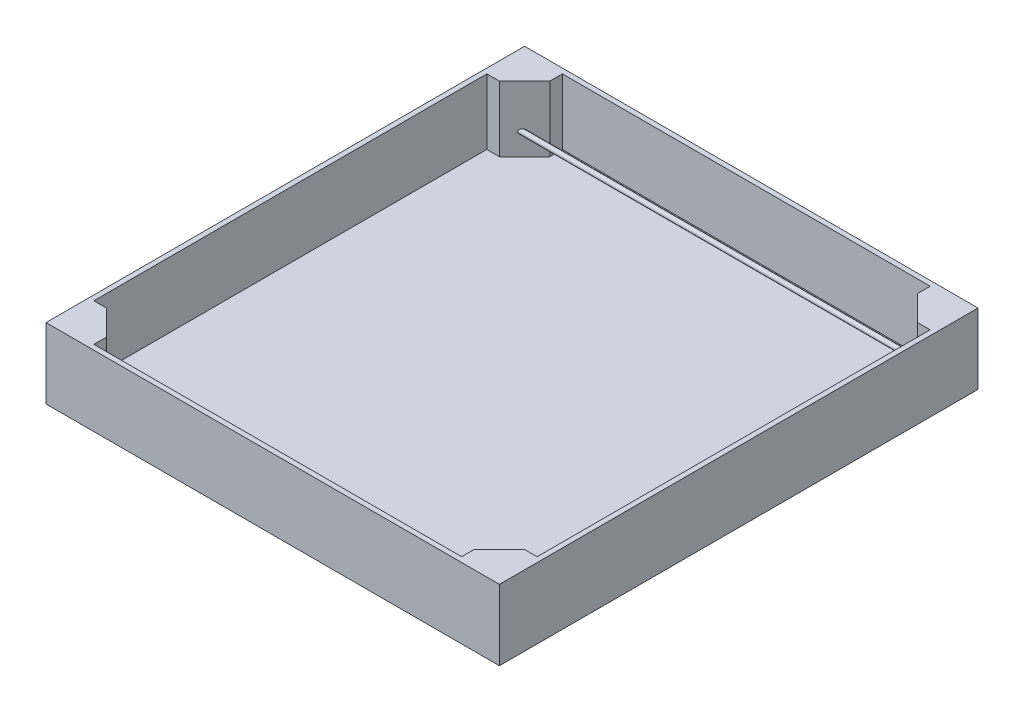
ISO-10303-21;
HEADER;
FILE_DESCRIPTION(('STEP AP214'),'2;1');
FILE_NAME('part.step','',(''),(''),'','','');
FILE_SCHEMA(('AUTOMOTIVE_DESIGN { 1 0 10303 214 1 1 1 1 }'));
ENDSEC;
DATA;
#1=APPLICATION_CONTEXT('core data for automotive mechanical design processes');
#2=APPLICATION_PROTOCOL_DEFINITION('international standard','automotive_design',2000,#1);
#3=PRODUCT_CONTEXT('',#1,'mechanical');
#4=PRODUCT('Part','Part','',(#3));
#5=PRODUCT_RELATED_PRODUCT_CATEGORY('part','',(#4));
#6=PRODUCT_DEFINITION_FORMATION('','',#4);
#7=PRODUCT_DEFINITION_CONTEXT('part definition',#1,'design');
#8=PRODUCT_DEFINITION('design','',#6,#7);
#9=PRODUCT_DEFINITION_SHAPE('','',#8);
#10=(LENGTH_UNIT() NAMED_UNIT(*) SI_UNIT(.MILLI.,.METRE.));
#11=(NAMED_UNIT(*) PLANE_ANGLE_UNIT() SI_UNIT($,.RADIAN.));
#12=(NAMED_UNIT(*) SI_UNIT($,.STERADIAN.) SOLID_ANGLE_UNIT());
#13=UNCERTAINTY_MEASURE_WITH_UNIT(LENGTH_MEASURE(1.E-05),#10,'distance_accuracy_value','');
#14=(GEOMETRIC_REPRESENTATION_CONTEXT(3) GLOBAL_UNCERTAINTY_ASSIGNED_CONTEXT((#13)) GLOBAL_UNIT_ASSIGNED_CONTEXT((#10,
#11,#12)) REPRESENTATION_CONTEXT('',''));
#15=CARTESIAN_POINT('',(0.,0.,0.));
#16=DIRECTION('',(0.,0.,1.));
#17=DIRECTION('',(1.,0.,0.));
#18=AXIS2_PLACEMENT_3D('',#15,#16,#17);
#19=CARTESIAN_POINT('',(0.,5.08,0.));
#20=DIRECTION('',(0.,1.,0.));
#21=DIRECTION('',(0.,0.,1.));
#22=AXIS2_PLACEMENT_3D('',#19,#20,#21);
#23=PLANE('',#22);
#24=DIRECTION('',(0.707106781186547,0.,-0.707106781186548));
#25=VECTOR('',#24,1.);
#26=CARTESIAN_POINT('',(43.18,5.08,-464.82));
#27=LINE('',#26,#25);
#28=CARTESIAN_POINT('',(17.78,5.08,-439.42));
#29=VERTEX_POINT('',#28);
#30=CARTESIAN_POINT('',(43.18,5.08,-464.82));
#31=VERTEX_POINT('',#30);
#32=EDGE_CURVE('E62',#29,#31,#27,.T.);
#33=ORIENTED_EDGE('',*,*,#32,.F.);
#34=DIRECTION('',(1.,0.,0.));
#35=VECTOR('',#34,1.);
#36=CARTESIAN_POINT('',(5.08,5.08,-439.42));
#37=LINE('',#36,#35);
#38=CARTESIAN_POINT('',(5.08,5.08,-439.42));
#39=VERTEX_POINT('',#38);
#40=EDGE_CURVE('E226',#39,#29,#37,.T.);
#41=ORIENTED_EDGE('',*,*,#40,.F.);
#42=DIRECTION('',(0.,0.,1.));
#43=VECTOR('',#42,1.);
#44=CARTESIAN_POINT('',(5.08,5.08,-5.08));
#45=LINE('',#44,#43);
#46=CARTESIAN_POINT('',(5.08,5.08,-43.18));
#47=VERTEX_POINT('',#46);
#48=EDGE_CURVE('E203',#39,#47,#45,.T.);
#49=ORIENTED_EDGE('',*,*,#48,.T.);
#50=DIRECTION('',(-1.,0.,0.));
#51=VECTOR('',#50,1.);
#52=CARTESIAN_POINT('',(17.78,5.08,-43.18));
#53=LINE('',#52,#51);
#54=CARTESIAN_POINT('',(17.78,5.08,-43.18));
#55=VERTEX_POINT('',#54);
#56=EDGE_CURVE('E317',#55,#47,#53,.T.);
#57=ORIENTED_EDGE('',*,*,#56,.F.);
#58=DIRECTION('',(-0.707499563151495,0.,-0.706713780918728));
#59=VECTOR('',#58,1.);
#60=CARTESIAN_POINT('',(43.2082417992279,5.08,-17.78));
#61=LINE('',#60,#59);
#62=CARTESIAN_POINT('',(43.2082417992279,5.08,-17.78));
#63=VERTEX_POINT('',#62);
#64=EDGE_CURVE('E325',#63,#55,#61,.T.);
#65=ORIENTED_EDGE('',*,*,#64,.F.);
#66=DIRECTION('',(0.,0.,-1.));
#67=VECTOR('',#66,1.);
#68=CARTESIAN_POINT('',(43.2082417992279,5.08,-5.08));
#69=LINE('',#68,#67);
#70=CARTESIAN_POINT('',(43.2082417992279,5.08,-5.08));
#71=VERTEX_POINT('',#70);
#72=EDGE_CURVE('E312',#71,#63,#69,.T.);
#73=ORIENTED_EDGE('',*,*,#72,.F.);
#74=DIRECTION('',(1.,0.,0.));
#75=VECTOR('',#74,1.);
#76=CARTESIAN_POINT('',(5.08,5.08,-5.08));
#77=LINE('',#76,#75);
#78=CARTESIAN_POINT('',(414.02,5.08,-5.08));
#79=VERTEX_POINT('',#78);
#80=EDGE_CURVE('E355',#71,#79,#77,.T.);
#81=ORIENTED_EDGE('',*,*,#80,.T.);
#82=DIRECTION('',(0.,0.,1.));
#83=VECTOR('',#82,1.);
#84=CARTESIAN_POINT('',(414.02,5.08,-5.08));
#85=LINE('',#84,#83);
#86=CARTESIAN_POINT('',(414.02,5.08,-17.78));
#87=VERTEX_POINT('',#86);
#88=EDGE_CURVE('E280',#87,#79,#85,.T.);
#89=ORIENTED_EDGE('',*,*,#88,.F.);
#90=DIRECTION('',(-0.708057357899682,0.,0.706154924874224));
#91=VECTOR('',#90,1.);
#92=CARTESIAN_POINT('',(414.02,5.08,-17.78));
#93=LINE('',#92,#91);
#94=CARTESIAN_POINT('',(439.42,5.08,-43.1117544005333));
#95=VERTEX_POINT('',#94);
#96=EDGE_CURVE('E291',#95,#87,#93,.T.);
#97=ORIENTED_EDGE('',*,*,#96,.F.);
#98=DIRECTION('',(-1.,0.,0.));
#99=VECTOR('',#98,1.);
#100=CARTESIAN_POINT('',(439.42,5.08,-43.1117544005334));
#101=LINE('',#100,#99);
#102=CARTESIAN_POINT('',(452.12,5.08,-43.1117544005334));
#103=VERTEX_POINT('',#102);
#104=EDGE_CURVE('E275',#103,#95,#101,.T.);
#105=ORIENTED_EDGE('',*,*,#104,.F.);
#106=DIRECTION('',(0.,0.,-1.));
#107=VECTOR('',#106,1.);
#108=CARTESIAN_POINT('',(452.12,5.08,-5.08));
#109=LINE('',#108,#107);
#110=CARTESIAN_POINT('',(452.12,5.08,-439.42));
#111=VERTEX_POINT('',#110);
#112=EDGE_CURVE('E359',#103,#111,#109,.T.);
#113=ORIENTED_EDGE('',*,*,#112,.T.);
#114=DIRECTION('',(-1.,0.,0.));
#115=VECTOR('',#114,1.);
#116=CARTESIAN_POINT('',(452.12,5.08,-439.42));
#117=LINE('',#116,#115);
#118=CARTESIAN_POINT('',(439.42,5.08,-439.42));
#119=VERTEX_POINT('',#118);
#120=EDGE_CURVE('E244',#111,#119,#117,.T.);
#121=ORIENTED_EDGE('',*,*,#120,.T.);
#122=DIRECTION('',(0.706147403745139,0.,0.708064858741061));
#123=VECTOR('',#122,1.);
#124=CARTESIAN_POINT('',(414.088783750945,5.08,-464.82));
#125=LINE('',#124,#123);
#126=CARTESIAN_POINT('',(414.088783750945,5.08,-464.82));
#127=VERTEX_POINT('',#126);
#128=EDGE_CURVE('E255',#127,#119,#125,.T.);
#129=ORIENTED_EDGE('',*,*,#128,.F.);
#130=DIRECTION('',(0.,0.,1.));
#131=VECTOR('',#130,1.);
#132=CARTESIAN_POINT('',(414.088783750945,5.08,-477.52));
#133=LINE('',#132,#131);
#134=CARTESIAN_POINT('',(414.088783750945,5.08,-477.52));
#135=VERTEX_POINT('',#134);
#136=EDGE_CURVE('E206',#135,#127,#133,.T.);
#137=ORIENTED_EDGE('',*,*,#136,.F.);
#138=DIRECTION('',(-1.,0.,0.));
#139=VECTOR('',#138,1.);
#140=CARTESIAN_POINT('',(5.08,5.08,-477.52));
#141=LINE('',#140,#139);
#142=CARTESIAN_POINT('',(43.18,5.08,-477.52));
#143=VERTEX_POINT('',#142);
#144=EDGE_CURVE('E197',#135,#143,#141,.T.);
#145=ORIENTED_EDGE('',*,*,#144,.T.);
#146=DIRECTION('',(0.,0.,-1.));
#147=VECTOR('',#146,1.);
#148=CARTESIAN_POINT('',(43.18,5.08,-477.52));
#149=LINE('',#148,#147);
#150=EDGE_CURVE('E67',#31,#143,#149,.T.);
#151=ORIENTED_EDGE('',*,*,#150,.F.);
#152=EDGE_LOOP('',(#33,#41,#49,#57,#65,#73,#81,#89,#97,#105,#113,#121,#129,#137,#145,#151));
#153=FACE_BOUND('',#152,.T.);
#154=ADVANCED_FACE('F45',(#153),#23,.T.);
#155=CARTESIAN_POINT('',(5.08,71.12,-477.52));
#156=DIRECTION('',(0.,0.,1.));
#157=DIRECTION('',(1.,0.,0.));
#158=AXIS2_PLACEMENT_3D('',#155,#156,#157);
#159=PLANE('',#158);
#160=DIRECTION('',(-1.,0.,0.));
#161=VECTOR('',#160,1.);
#162=CARTESIAN_POINT('',(5.08,71.12,-477.52));
#163=LINE('',#162,#161);
#164=CARTESIAN_POINT('',(414.088783750945,71.12,-477.52));
#165=VERTEX_POINT('',#164);
#166=CARTESIAN_POINT('',(43.18,71.12,-477.52));
#167=VERTEX_POINT('',#166);
#168=EDGE_CURVE('E349',#165,#167,#163,.T.);
#169=ORIENTED_EDGE('',*,*,#168,.T.);
#170=DIRECTION('',(0.,-1.,0.));
#171=VECTOR('',#170,1.);
#172=CARTESIAN_POINT('',(43.18,71.12,-477.52));
#173=LINE('',#172,#171);
#174=EDGE_CURVE('E225',#167,#143,#173,.T.);
#175=ORIENTED_EDGE('',*,*,#174,.T.);
#176=ORIENTED_EDGE('',*,*,#144,.F.);
#177=DIRECTION('',(0.,-1.,0.));
#178=VECTOR('',#177,1.);
#179=CARTESIAN_POINT('',(414.088783750945,71.12,-477.52));
#180=LINE('',#179,#178);
#181=EDGE_CURVE('E251',#165,#135,#180,.T.);
#182=ORIENTED_EDGE('',*,*,#181,.F.);
#183=EDGE_LOOP('',(#169,#175,#176,#182));
#184=FACE_BOUND('',#183,.T.);
#185=ADVANCED_FACE('F456',(#184),#159,.T.);
#186=CARTESIAN_POINT('',(5.08,71.12,-5.08));
#187=DIRECTION('',(1.,0.,0.));
#188=DIRECTION('',(0.,0.,-1.));
#189=AXIS2_PLACEMENT_3D('',#186,#187,#188);
#190=PLANE('',#189);
#191=ORIENTED_EDGE('',*,*,#48,.F.);
#192=DIRECTION('',(0.,-1.,0.));
#193=VECTOR('',#192,1.);
#194=CARTESIAN_POINT('',(5.08,71.12,-439.42));
#195=LINE('',#194,#193);
#196=CARTESIAN_POINT('',(5.08,71.12,-439.42));
#197=VERTEX_POINT('',#196);
#198=EDGE_CURVE('E201',#197,#39,#195,.T.);
#199=ORIENTED_EDGE('',*,*,#198,.F.);
#200=DIRECTION('',(0.,0.,1.));
#201=VECTOR('',#200,1.);
#202=CARTESIAN_POINT('',(5.08,71.12,-5.08));
#203=LINE('',#202,#201);
#204=CARTESIAN_POINT('',(5.08,71.12,-43.18));
#205=VERTEX_POINT('',#204);
#206=EDGE_CURVE('E182',#197,#205,#203,.T.);
#207=ORIENTED_EDGE('',*,*,#206,.T.);
#208=DIRECTION('',(0.,-1.,0.));
#209=VECTOR('',#208,1.);
#210=CARTESIAN_POINT('',(5.08,71.12,-43.18));
#211=LINE('',#210,#209);
#212=EDGE_CURVE('E322',#205,#47,#211,.T.);
#213=ORIENTED_EDGE('',*,*,#212,.T.);
#214=EDGE_LOOP('',(#191,#199,#207,#213));
#215=FACE_BOUND('',#214,.T.);
#216=ADVANCED_FACE('F202',(#215),#190,.T.);
#217=CARTESIAN_POINT('',(5.08,71.12,-5.08));
#218=DIRECTION('',(0.,0.,-1.));
#219=DIRECTION('',(-1.,0.,0.));
#220=AXIS2_PLACEMENT_3D('',#217,#218,#219);
#221=PLANE('',#220);
#222=DIRECTION('',(1.,0.,0.));
#223=VECTOR('',#222,1.);
#224=CARTESIAN_POINT('',(5.08,71.12,-5.08));
#225=LINE('',#224,#223);
#226=CARTESIAN_POINT('',(43.2082417992279,71.12,-5.08));
#227=VERTEX_POINT('',#226);
#228=CARTESIAN_POINT('',(414.02,71.12,-5.08));
#229=VERTEX_POINT('',#228);
#230=EDGE_CURVE('E196',#227,#229,#225,.T.);
#231=ORIENTED_EDGE('',*,*,#230,.T.);
#232=DIRECTION('',(0.,-1.,0.));
#233=VECTOR('',#232,1.);
#234=CARTESIAN_POINT('',(414.02,71.12,-5.08));
#235=LINE('',#234,#233);
#236=EDGE_CURVE('E287',#229,#79,#235,.T.);
#237=ORIENTED_EDGE('',*,*,#236,.T.);
#238=ORIENTED_EDGE('',*,*,#80,.F.);
#239=DIRECTION('',(0.,-1.,0.));
#240=VECTOR('',#239,1.);
#241=CARTESIAN_POINT('',(43.2082417992279,71.12,-5.08));
#242=LINE('',#241,#240);
#243=EDGE_CURVE('E341',#227,#71,#242,.T.);
#244=ORIENTED_EDGE('',*,*,#243,.F.);
#245=EDGE_LOOP('',(#231,#237,#238,#244));
#246=FACE_BOUND('',#245,.T.);
#247=ADVANCED_FACE('F524',(#246),#221,.T.);
#248=CARTESIAN_POINT('',(452.12,71.12,-5.08));
#249=DIRECTION('',(-1.,0.,0.));
#250=DIRECTION('',(0.,0.,1.));
#251=AXIS2_PLACEMENT_3D('',#248,#249,#250);
#252=PLANE('',#251);
#253=DIRECTION('',(0.,-1.,0.));
#254=VECTOR('',#253,1.);
#255=CARTESIAN_POINT('',(452.12,71.12,-439.42));
#256=LINE('',#255,#254);
#257=CARTESIAN_POINT('',(452.12,71.12,-439.42));
#258=VERTEX_POINT('',#257);
#259=EDGE_CURVE('E264',#258,#111,#256,.T.);
#260=ORIENTED_EDGE('',*,*,#259,.T.);
#261=ORIENTED_EDGE('',*,*,#112,.F.);
#262=DIRECTION('',(0.,-1.,0.));
#263=VECTOR('',#262,1.);
#264=CARTESIAN_POINT('',(452.12,71.12,-43.1117544005334));
#265=LINE('',#264,#263);
#266=CARTESIAN_POINT('',(452.12,71.12,-43.1117544005334));
#267=VERTEX_POINT('',#266);
#268=EDGE_CURVE('E308',#267,#103,#265,.T.);
#269=ORIENTED_EDGE('',*,*,#268,.F.);
#270=DIRECTION('',(0.,0.,-1.));
#271=VECTOR('',#270,1.);
#272=CARTESIAN_POINT('',(452.12,71.12,-5.08));
#273=LINE('',#272,#271);
#274=EDGE_CURVE('E346',#267,#258,#273,.T.);
#275=ORIENTED_EDGE('',*,*,#274,.T.);
#276=EDGE_LOOP('',(#260,#261,#269,#275));
#277=FACE_BOUND('',#276,.T.);
#278=ADVANCED_FACE('F443',(#277),#252,.T.);
#279=CARTESIAN_POINT('',(0.,5.08,-482.6));
#280=DIRECTION('',(0.,0.,-1.));
#281=DIRECTION('',(-1.,0.,0.));
#282=AXIS2_PLACEMENT_3D('',#279,#280,#281);
#283=PLANE('',#282);
#284=DIRECTION('',(1.,0.,0.));
#285=VECTOR('',#284,1.);
#286=CARTESIAN_POINT('',(0.,0.,-482.6));
#287=LINE('',#286,#285);
#288=CARTESIAN_POINT('',(0.,0.,-482.6));
#289=VERTEX_POINT('',#288);
#290=CARTESIAN_POINT('',(457.2,0.,-482.6));
#291=VERTEX_POINT('',#290);
#292=EDGE_CURVE('E380',#289,#291,#287,.T.);
#293=ORIENTED_EDGE('',*,*,#292,.F.);
#294=DIRECTION('',(0.,-1.,0.));
#295=VECTOR('',#294,1.);
#296=CARTESIAN_POINT('',(0.,5.08,-482.6));
#297=LINE('',#296,#295);
#298=CARTESIAN_POINT('',(0.,71.12,-482.6));
#299=VERTEX_POINT('',#298);
#300=EDGE_CURVE('E396',#299,#289,#297,.T.);
#301=ORIENTED_EDGE('',*,*,#300,.F.);
#302=DIRECTION('',(-1.,0.,0.));
#303=VECTOR('',#302,1.);
#304=CARTESIAN_POINT('',(0.,71.12,-482.6));
#305=LINE('',#304,#303);
#306=CARTESIAN_POINT('',(457.2,71.12,-482.6));
#307=VERTEX_POINT('',#306);
#308=EDGE_CURVE('E376',#307,#299,#305,.T.);
#309=ORIENTED_EDGE('',*,*,#308,.F.);
#310=DIRECTION('',(0.,-1.,0.));
#311=VECTOR('',#310,1.);
#312=CARTESIAN_POINT('',(457.2,5.08,-482.6));
#313=LINE('',#312,#311);
#314=EDGE_CURVE('E395',#307,#291,#313,.T.);
#315=ORIENTED_EDGE('',*,*,#314,.T.);
#316=EDGE_LOOP('',(#293,#301,#309,#315));
#317=FACE_BOUND('',#316,.T.);
#318=ADVANCED_FACE('F47',(#317),#283,.T.);
#319=CARTESIAN_POINT('',(0.,5.08,0.));
#320=DIRECTION('',(-1.,0.,0.));
#321=DIRECTION('',(0.,0.,1.));
#322=AXIS2_PLACEMENT_3D('',#319,#320,#321);
#323=PLANE('',#322);
#324=DIRECTION('',(0.,0.,-1.));
#325=VECTOR('',#324,1.);
#326=CARTESIAN_POINT('',(0.,0.,0.));
#327=LINE('',#326,#325);
#328=CARTESIAN_POINT('',(0.,0.,0.));
#329=VERTEX_POINT('',#328);
#330=EDGE_CURVE('E391',#329,#289,#327,.T.);
#331=ORIENTED_EDGE('',*,*,#330,.F.);
#332=DIRECTION('',(0.,-1.,0.));
#333=VECTOR('',#332,1.);
#334=CARTESIAN_POINT('',(0.,5.08,0.));
#335=LINE('',#334,#333);
#336=CARTESIAN_POINT('',(0.,71.12,0.));
#337=VERTEX_POINT('',#336);
#338=EDGE_CURVE('E400',#337,#329,#335,.T.);
#339=ORIENTED_EDGE('',*,*,#338,.F.);
#340=DIRECTION('',(0.,0.,1.));
#341=VECTOR('',#340,1.);
#342=CARTESIAN_POINT('',(0.,71.12,0.));
#343=LINE('',#342,#341);
#344=EDGE_CURVE('E352',#299,#337,#343,.T.);
#345=ORIENTED_EDGE('',*,*,#344,.F.);
#346=ORIENTED_EDGE('',*,*,#300,.T.);
#347=EDGE_LOOP('',(#331,#339,#345,#346));
#348=FACE_BOUND('',#347,.T.);
#349=ADVANCED_FACE('F484',(#348),#323,.T.);
#350=CARTESIAN_POINT('',(0.,5.08,0.));
#351=DIRECTION('',(0.,0.,-1.));
#352=DIRECTION('',(-1.,0.,0.));
#353=AXIS2_PLACEMENT_3D('',#350,#351,#352);
#354=PLANE('',#353);
#355=DIRECTION('',(1.,0.,0.));
#356=VECTOR('',#355,1.);
#357=CARTESIAN_POINT('',(0.,0.,0.));
#358=LINE('',#357,#356);
#359=CARTESIAN_POINT('',(457.2,0.,0.));
#360=VERTEX_POINT('',#359);
#361=EDGE_CURVE('E388',#329,#360,#358,.T.);
#362=ORIENTED_EDGE('',*,*,#361,.T.);
#363=DIRECTION('',(0.,-1.,0.));
#364=VECTOR('',#363,1.);
#365=CARTESIAN_POINT('',(457.2,5.08,0.));
#366=LINE('',#365,#364);
#367=CARTESIAN_POINT('',(457.2,71.12,0.));
#368=VERTEX_POINT('',#367);
#369=EDGE_CURVE('E403',#368,#360,#366,.T.);
#370=ORIENTED_EDGE('',*,*,#369,.F.);
#371=DIRECTION('',(1.,0.,0.));
#372=VECTOR('',#371,1.);
#373=CARTESIAN_POINT('',(0.,71.12,0.));
#374=LINE('',#373,#372);
#375=EDGE_CURVE('E368',#337,#368,#374,.T.);
#376=ORIENTED_EDGE('',*,*,#375,.F.);
#377=ORIENTED_EDGE('',*,*,#338,.T.);
#378=EDGE_LOOP('',(#362,#370,#376,#377));
#379=FACE_BOUND('',#378,.T.);
#380=ADVANCED_FACE('F487',(#379),#354,.F.);
#381=CARTESIAN_POINT('',(457.2,5.08,0.));
#382=DIRECTION('',(-1.,0.,0.));
#383=DIRECTION('',(0.,0.,1.));
#384=AXIS2_PLACEMENT_3D('',#381,#382,#383);
#385=PLANE('',#384);
#386=DIRECTION('',(0.,0.,-1.));
#387=VECTOR('',#386,1.);
#388=CARTESIAN_POINT('',(457.2,0.,0.));
#389=LINE('',#388,#387);
#390=EDGE_CURVE('E384',#360,#291,#389,.T.);
#391=ORIENTED_EDGE('',*,*,#390,.T.);
#392=ORIENTED_EDGE('',*,*,#314,.F.);
#393=DIRECTION('',(0.,0.,-1.));
#394=VECTOR('',#393,1.);
#395=CARTESIAN_POINT('',(457.2,71.12,0.));
#396=LINE('',#395,#394);
#397=EDGE_CURVE('E372',#368,#307,#396,.T.);
#398=ORIENTED_EDGE('',*,*,#397,.F.);
#399=ORIENTED_EDGE('',*,*,#369,.T.);
#400=EDGE_LOOP('',(#391,#392,#398,#399));
#401=FACE_BOUND('',#400,.T.);
#402=ADVANCED_FACE('F482',(#401),#385,.F.);
#403=CARTESIAN_POINT('',(0.,0.,0.));
#404=DIRECTION('',(0.,1.,0.));
#405=DIRECTION('',(0.,0.,1.));
#406=AXIS2_PLACEMENT_3D('',#403,#404,#405);
#407=PLANE('',#406);
#408=ORIENTED_EDGE('',*,*,#292,.T.);
#409=ORIENTED_EDGE('',*,*,#390,.F.);
#410=ORIENTED_EDGE('',*,*,#361,.F.);
#411=ORIENTED_EDGE('',*,*,#330,.T.);
#412=EDGE_LOOP('',(#408,#409,#410,#411));
#413=FACE_BOUND('',#412,.T.);
#414=ADVANCED_FACE('F479',(#413),#407,.F.);
#415=CARTESIAN_POINT('',(0.,71.12,0.));
#416=DIRECTION('',(0.,-1.,0.));
#417=DIRECTION('',(0.,0.,-1.));
#418=AXIS2_PLACEMENT_3D('',#415,#416,#417);
#419=PLANE('',#418);
#420=DIRECTION('',(-1.,0.,0.));
#421=VECTOR('',#420,1.);
#422=CARTESIAN_POINT('',(452.12,71.12,-439.42));
#423=LINE('',#422,#421);
#424=CARTESIAN_POINT('',(439.42,71.12,-439.42));
#425=VERTEX_POINT('',#424);
#426=EDGE_CURVE('E247',#258,#425,#423,.T.);
#427=ORIENTED_EDGE('',*,*,#426,.F.);
#428=ORIENTED_EDGE('',*,*,#274,.F.);
#429=DIRECTION('',(-1.,0.,0.));
#430=VECTOR('',#429,1.);
#431=CARTESIAN_POINT('',(439.42,71.12,-43.1117544005334));
#432=LINE('',#431,#430);
#433=CARTESIAN_POINT('',(439.42,71.12,-43.1117544005334));
#434=VERTEX_POINT('',#433);
#435=EDGE_CURVE('E276',#267,#434,#432,.T.);
#436=ORIENTED_EDGE('',*,*,#435,.T.);
#437=DIRECTION('',(-0.708057357899682,0.,0.706154924874224));
#438=VECTOR('',#437,1.);
#439=CARTESIAN_POINT('',(414.02,71.12,-17.78));
#440=LINE('',#439,#438);
#441=CARTESIAN_POINT('',(414.02,71.12,-17.78));
#442=VERTEX_POINT('',#441);
#443=EDGE_CURVE('E279',#434,#442,#440,.T.);
#444=ORIENTED_EDGE('',*,*,#443,.T.);
#445=DIRECTION('',(0.,0.,1.));
#446=VECTOR('',#445,1.);
#447=CARTESIAN_POINT('',(414.02,71.12,-5.08));
#448=LINE('',#447,#446);
#449=EDGE_CURVE('E283',#442,#229,#448,.T.);
#450=ORIENTED_EDGE('',*,*,#449,.T.);
#451=ORIENTED_EDGE('',*,*,#230,.F.);
#452=DIRECTION('',(0.,0.,-1.));
#453=VECTOR('',#452,1.);
#454=CARTESIAN_POINT('',(43.2082417992279,71.12,-5.08));
#455=LINE('',#454,#453);
#456=CARTESIAN_POINT('',(43.2082417992279,71.12,-17.78));
#457=VERTEX_POINT('',#456);
#458=EDGE_CURVE('E313',#227,#457,#455,.T.);
#459=ORIENTED_EDGE('',*,*,#458,.T.);
#460=DIRECTION('',(-0.707499563151495,0.,-0.706713780918728));
#461=VECTOR('',#460,1.);
#462=CARTESIAN_POINT('',(43.2082417992279,71.12,-17.78));
#463=LINE('',#462,#461);
#464=CARTESIAN_POINT('',(17.78,71.12,-43.18));
#465=VERTEX_POINT('',#464);
#466=EDGE_CURVE('E316',#457,#465,#463,.T.);
#467=ORIENTED_EDGE('',*,*,#466,.T.);
#468=DIRECTION('',(-1.,0.,0.));
#469=VECTOR('',#468,1.);
#470=CARTESIAN_POINT('',(17.78,71.12,-43.18));
#471=LINE('',#470,#469);
#472=EDGE_CURVE('E191',#465,#205,#471,.T.);
#473=ORIENTED_EDGE('',*,*,#472,.T.);
#474=ORIENTED_EDGE('',*,*,#206,.F.);
#475=DIRECTION('',(1.,0.,0.));
#476=VECTOR('',#475,1.);
#477=CARTESIAN_POINT('',(5.08,71.12,-439.42));
#478=LINE('',#477,#476);
#479=CARTESIAN_POINT('',(17.78,71.12,-439.42));
#480=VERTEX_POINT('',#479);
#481=EDGE_CURVE('E188',#197,#480,#478,.T.);
#482=ORIENTED_EDGE('',*,*,#481,.T.);
#483=DIRECTION('',(0.707106781186547,0.,-0.707106781186548));
#484=VECTOR('',#483,1.);
#485=CARTESIAN_POINT('',(43.18,71.12,-464.82));
#486=LINE('',#485,#484);
#487=CARTESIAN_POINT('',(43.18,71.12,-464.82));
#488=VERTEX_POINT('',#487);
#489=EDGE_CURVE('E213',#480,#488,#486,.T.);
#490=ORIENTED_EDGE('',*,*,#489,.T.);
#491=DIRECTION('',(0.,0.,-1.));
#492=VECTOR('',#491,1.);
#493=CARTESIAN_POINT('',(43.18,71.12,-477.52));
#494=LINE('',#493,#492);
#495=EDGE_CURVE('E217',#488,#167,#494,.T.);
#496=ORIENTED_EDGE('',*,*,#495,.T.);
#497=ORIENTED_EDGE('',*,*,#168,.F.);
#498=DIRECTION('',(0.,0.,1.));
#499=VECTOR('',#498,1.);
#500=CARTESIAN_POINT('',(414.088783750945,71.12,-477.52));
#501=LINE('',#500,#499);
#502=CARTESIAN_POINT('',(414.088783750945,71.12,-464.82));
#503=VERTEX_POINT('',#502);
#504=EDGE_CURVE('E239',#165,#503,#501,.T.);
#505=ORIENTED_EDGE('',*,*,#504,.T.);
#506=DIRECTION('',(0.706147403745139,0.,0.708064858741061));
#507=VECTOR('',#506,1.);
#508=CARTESIAN_POINT('',(414.088783750945,71.12,-464.82));
#509=LINE('',#508,#507);
#510=EDGE_CURVE('E243',#503,#425,#509,.T.);
#511=ORIENTED_EDGE('',*,*,#510,.T.);
#512=EDGE_LOOP('',(#427,#428,#436,#444,#450,#451,#459,#467,#473,#474,#482,#490,#496,#497,#505,#511));
#513=FACE_BOUND('',#512,.T.);
#514=ORIENTED_EDGE('',*,*,#344,.T.);
#515=ORIENTED_EDGE('',*,*,#375,.T.);
#516=ORIENTED_EDGE('',*,*,#397,.T.);
#517=ORIENTED_EDGE('',*,*,#308,.T.);
#518=EDGE_LOOP('',(#514,#515,#516,#517));
#519=FACE_BOUND('',#518,.T.);
#520=ADVANCED_FACE('F185',(#513,#519),#419,.F.);
#521=CARTESIAN_POINT('',(43.2082417992279,71.12,-5.08));
#522=DIRECTION('',(-1.,0.,0.));
#523=DIRECTION('',(0.,0.,1.));
#524=AXIS2_PLACEMENT_3D('',#521,#522,#523);
#525=PLANE('',#524);
#526=ORIENTED_EDGE('',*,*,#72,.T.);
#527=DIRECTION('',(0.,-1.,0.));
#528=VECTOR('',#527,1.);
#529=CARTESIAN_POINT('',(43.2082417992279,71.12,-17.78));
#530=LINE('',#529,#528);
#531=EDGE_CURVE('E337',#457,#63,#530,.T.);
#532=ORIENTED_EDGE('',*,*,#531,.F.);
#533=ORIENTED_EDGE('',*,*,#458,.F.);
#534=ORIENTED_EDGE('',*,*,#243,.T.);
#535=EDGE_LOOP('',(#526,#532,#533,#534));
#536=FACE_BOUND('',#535,.T.);
#537=ADVANCED_FACE('F506',(#536),#525,.F.);
#538=CARTESIAN_POINT('',(43.2082417992279,71.12,-17.78));
#539=DIRECTION('',(-0.706713780918728,0.,0.707499563151495));
#540=DIRECTION('',(0.707499563151495,0.,0.706713780918728));
#541=AXIS2_PLACEMENT_3D('',#538,#539,#540);
#542=PLANE('',#541);
#543=CARTESIAN_POINT('',(27.4600039326356,26.9471897595679,-33.5107471342195));
#544=DIRECTION('',(-0.706713780918728,0.,0.707499563151495));
#545=DIRECTION('',(-0.707499563151495,0.,-0.706713780918728));
#546=AXIS2_PLACEMENT_3D('',#543,#544,#545);
#547=ELLIPSE('',#546,3.53750000000001,2.50000000000001);
#548=CARTESIAN_POINT('',(24.9572242279872,26.9471897595679,-36.0107471342195));
#549=VERTEX_POINT('',#548);
#550=EDGE_CURVE('E11',#549,#549,#547,.F.);
#551=ORIENTED_EDGE('',*,*,#550,.F.);
#552=EDGE_LOOP('',(#551));
#553=FACE_BOUND('',#552,.T.);
#554=ORIENTED_EDGE('',*,*,#64,.T.);
#555=DIRECTION('',(0.,-1.,0.));
#556=VECTOR('',#555,1.);
#557=CARTESIAN_POINT('',(17.78,71.12,-43.18));
#558=LINE('',#557,#556);
#559=EDGE_CURVE('E334',#465,#55,#558,.T.);
#560=ORIENTED_EDGE('',*,*,#559,.F.);
#561=ORIENTED_EDGE('',*,*,#466,.F.);
#562=ORIENTED_EDGE('',*,*,#531,.T.);
#563=EDGE_LOOP('',(#554,#560,#561,#562));
#564=FACE_BOUND('',#563,.T.);
#565=ADVANCED_FACE('F511',(#553,#564),#542,.F.);
#566=CARTESIAN_POINT('',(17.78,71.12,-43.18));
#567=DIRECTION('',(0.,0.,1.));
#568=DIRECTION('',(1.,0.,0.));
#569=AXIS2_PLACEMENT_3D('',#566,#567,#568);
#570=PLANE('',#569);
#571=ORIENTED_EDGE('',*,*,#56,.T.);
#572=ORIENTED_EDGE('',*,*,#212,.F.);
#573=ORIENTED_EDGE('',*,*,#472,.F.);
#574=ORIENTED_EDGE('',*,*,#559,.T.);
#575=EDGE_LOOP('',(#571,#572,#573,#574));
#576=FACE_BOUND('',#575,.T.);
#577=ADVANCED_FACE('F518',(#576),#570,.F.);
#578=CARTESIAN_POINT('',(439.42,71.12,-43.1117544005334));
#579=DIRECTION('',(0.,0.,1.));
#580=DIRECTION('',(1.,0.,0.));
#581=AXIS2_PLACEMENT_3D('',#578,#579,#580);
#582=PLANE('',#581);
#583=ORIENTED_EDGE('',*,*,#104,.T.);
#584=DIRECTION('',(0.,-1.,0.));
#585=VECTOR('',#584,1.);
#586=CARTESIAN_POINT('',(439.42,71.12,-43.1117544005334));
#587=LINE('',#586,#585);
#588=EDGE_CURVE('E304',#434,#95,#587,.T.);
#589=ORIENTED_EDGE('',*,*,#588,.F.);
#590=ORIENTED_EDGE('',*,*,#435,.F.);
#591=ORIENTED_EDGE('',*,*,#268,.T.);
#592=EDGE_LOOP('',(#583,#589,#590,#591));
#593=FACE_BOUND('',#592,.T.);
#594=ADVANCED_FACE('F428',(#593),#582,.F.);
#595=CARTESIAN_POINT('',(414.02,71.12,-17.78));
#596=DIRECTION('',(0.706154924874224,0.,0.708057357899682));
#597=DIRECTION('',(0.708057357899682,0.,-0.706154924874224));
#598=AXIS2_PLACEMENT_3D('',#595,#596,#597);
#599=PLANE('',#598);
#600=CARTESIAN_POINT('',(429.793126917762,26.9471897595679,-33.5107471342195));
#601=DIRECTION('',(0.706154924874224,0.,0.708057357899682));
#602=DIRECTION('',(-0.708057357899682,0.,0.706154924874224));
#603=AXIS2_PLACEMENT_3D('',#600,#601,#602);
#604=ELLIPSE('',#603,3.54029960273278,2.50000000000001);
#605=CARTESIAN_POINT('',(427.286391734877,26.9471897595679,-31.0107471342195));
#606=VERTEX_POINT('',#605);
#607=EDGE_CURVE('E49',#606,#606,#604,.F.);
#608=ORIENTED_EDGE('',*,*,#607,.F.);
#609=EDGE_LOOP('',(#608));
#610=FACE_BOUND('',#609,.T.);
#611=ORIENTED_EDGE('',*,*,#96,.T.);
#612=DIRECTION('',(0.,-1.,0.));
#613=VECTOR('',#612,1.);
#614=CARTESIAN_POINT('',(414.02,71.12,-17.78));
#615=LINE('',#614,#613);
#616=EDGE_CURVE('E300',#442,#87,#615,.T.);
#617=ORIENTED_EDGE('',*,*,#616,.F.);
#618=ORIENTED_EDGE('',*,*,#443,.F.);
#619=ORIENTED_EDGE('',*,*,#588,.T.);
#620=EDGE_LOOP('',(#611,#617,#618,#619));
#621=FACE_BOUND('',#620,.T.);
#622=ADVANCED_FACE('F424',(#610,#621),#599,.F.);
#623=CARTESIAN_POINT('',(414.02,71.12,-5.08));
#624=DIRECTION('',(1.,0.,0.));
#625=DIRECTION('',(0.,0.,-1.));
#626=AXIS2_PLACEMENT_3D('',#623,#624,#625);
#627=PLANE('',#626);
#628=ORIENTED_EDGE('',*,*,#88,.T.);
#629=ORIENTED_EDGE('',*,*,#236,.F.);
#630=ORIENTED_EDGE('',*,*,#449,.F.);
#631=ORIENTED_EDGE('',*,*,#616,.T.);
#632=EDGE_LOOP('',(#628,#629,#630,#631));
#633=FACE_BOUND('',#632,.T.);
#634=ADVANCED_FACE('F427',(#633),#627,.F.);
#635=CARTESIAN_POINT('',(414.088783750945,71.12,-477.52));
#636=DIRECTION('',(1.,0.,0.));
#637=DIRECTION('',(0.,0.,-1.));
#638=AXIS2_PLACEMENT_3D('',#635,#636,#637);
#639=PLANE('',#638);
#640=ORIENTED_EDGE('',*,*,#136,.T.);
#641=DIRECTION('',(0.,-1.,0.));
#642=VECTOR('',#641,1.);
#643=CARTESIAN_POINT('',(414.088783750945,71.12,-464.82));
#644=LINE('',#643,#642);
#645=EDGE_CURVE('E271',#503,#127,#644,.T.);
#646=ORIENTED_EDGE('',*,*,#645,.F.);
#647=ORIENTED_EDGE('',*,*,#504,.F.);
#648=ORIENTED_EDGE('',*,*,#181,.T.);
#649=EDGE_LOOP('',(#640,#646,#647,#648));
#650=FACE_BOUND('',#649,.T.);
#651=ADVANCED_FACE('F458',(#650),#639,.F.);
#652=CARTESIAN_POINT('',(414.088783750945,71.12,-464.82));
#653=DIRECTION('',(0.708064858741062,0.,-0.706147403745139));
#654=DIRECTION('',(-0.706147403745139,0.,-0.708064858741062));
#655=AXIS2_PLACEMENT_3D('',#652,#653,#654);
#656=PLANE('',#655);
#657=CARTESIAN_POINT('',(427.850078401085,26.9471897595679,-451.021338274604));
#658=DIRECTION('',(0.708064858741062,0.,-0.706147403745139));
#659=DIRECTION('',(-0.706147403745139,0.,-0.708064858741062));
#660=AXIS2_PLACEMENT_3D('',#657,#658,#659);
#661=ELLIPSE('',#660,3.53075000000003,2.50000000000002);
#662=CARTESIAN_POINT('',(425.356848455312,26.9471897595679,-453.521338274604));
#663=VERTEX_POINT('',#662);
#664=EDGE_CURVE('E410',#663,#663,#661,.F.);
#665=ORIENTED_EDGE('',*,*,#664,.F.);
#666=EDGE_LOOP('',(#665));
#667=FACE_BOUND('',#666,.T.);
#668=ORIENTED_EDGE('',*,*,#128,.T.);
#669=DIRECTION('',(0.,-1.,0.));
#670=VECTOR('',#669,1.);
#671=CARTESIAN_POINT('',(439.42,71.12,-439.42));
#672=LINE('',#671,#670);
#673=EDGE_CURVE('E267',#425,#119,#672,.T.);
#674=ORIENTED_EDGE('',*,*,#673,.F.);
#675=ORIENTED_EDGE('',*,*,#510,.F.);
#676=ORIENTED_EDGE('',*,*,#645,.T.);
#677=EDGE_LOOP('',(#668,#674,#675,#676));
#678=FACE_BOUND('',#677,.T.);
#679=ADVANCED_FACE('F451',(#667,#678),#656,.F.);
#680=CARTESIAN_POINT('',(452.12,71.12,-439.42));
#681=DIRECTION('',(0.,0.,1.));
#682=DIRECTION('',(1.,0.,0.));
#683=AXIS2_PLACEMENT_3D('',#680,#681,#682);
#684=PLANE('',#683);
#685=ORIENTED_EDGE('',*,*,#120,.F.);
#686=ORIENTED_EDGE('',*,*,#259,.F.);
#687=ORIENTED_EDGE('',*,*,#426,.T.);
#688=ORIENTED_EDGE('',*,*,#673,.T.);
#689=EDGE_LOOP('',(#685,#686,#687,#688));
#690=FACE_BOUND('',#689,.T.);
#691=ADVANCED_FACE('F446',(#690),#684,.T.);
#692=CARTESIAN_POINT('',(5.08,71.12,-439.42));
#693=DIRECTION('',(0.,0.,-1.));
#694=DIRECTION('',(-1.,0.,0.));
#695=AXIS2_PLACEMENT_3D('',#692,#693,#694);
#696=PLANE('',#695);
#697=ORIENTED_EDGE('',*,*,#40,.T.);
#698=DIRECTION('',(0.,-1.,0.));
#699=VECTOR('',#698,1.);
#700=CARTESIAN_POINT('',(17.78,71.12,-439.42));
#701=LINE('',#700,#699);
#702=EDGE_CURVE('E207',#480,#29,#701,.T.);
#703=ORIENTED_EDGE('',*,*,#702,.F.);
#704=ORIENTED_EDGE('',*,*,#481,.F.);
#705=ORIENTED_EDGE('',*,*,#198,.T.);
#706=EDGE_LOOP('',(#697,#703,#704,#705));
#707=FACE_BOUND('',#706,.T.);
#708=ADVANCED_FACE('F209',(#707),#696,.F.);
#709=CARTESIAN_POINT('',(43.18,71.12,-464.82));
#710=DIRECTION('',(-0.707106781186548,0.,-0.707106781186547));
#711=DIRECTION('',(-0.707106781186547,0.,0.707106781186548));
#712=AXIS2_PLACEMENT_3D('',#709,#710,#711);
#713=PLANE('',#712);
#714=CARTESIAN_POINT('',(29.3813382746042,26.9471897595679,-451.021338274604));
#715=DIRECTION('',(-0.707106781186548,0.,-0.707106781186547));
#716=DIRECTION('',(-0.707106781186547,0.,0.707106781186548));
#717=AXIS2_PLACEMENT_3D('',#714,#715,#716);
#718=ELLIPSE('',#717,3.53553390593277,2.50000000000002);
#719=CARTESIAN_POINT('',(26.8813382746042,26.9471897595679,-448.521338274604));
#720=VERTEX_POINT('',#719);
#721=EDGE_CURVE('E399',#720,#720,#718,.F.);
#722=ORIENTED_EDGE('',*,*,#721,.F.);
#723=EDGE_LOOP('',(#722));
#724=FACE_BOUND('',#723,.T.);
#725=ORIENTED_EDGE('',*,*,#32,.T.);
#726=DIRECTION('',(0.,-1.,0.));
#727=VECTOR('',#726,1.);
#728=CARTESIAN_POINT('',(43.18,71.12,-464.82));
#729=LINE('',#728,#727);
#730=EDGE_CURVE('E233',#488,#31,#729,.T.);
#731=ORIENTED_EDGE('',*,*,#730,.F.);
#732=ORIENTED_EDGE('',*,*,#489,.F.);
#733=ORIENTED_EDGE('',*,*,#702,.T.);
#734=EDGE_LOOP('',(#725,#731,#732,#733));
#735=FACE_BOUND('',#734,.T.);
#736=ADVANCED_FACE('F555',(#724,#735),#713,.F.);
#737=CARTESIAN_POINT('',(43.18,71.12,-477.52));
#738=DIRECTION('',(-1.,0.,0.));
#739=DIRECTION('',(0.,0.,1.));
#740=AXIS2_PLACEMENT_3D('',#737,#738,#739);
#741=PLANE('',#740);
#742=ORIENTED_EDGE('',*,*,#150,.T.);
#743=ORIENTED_EDGE('',*,*,#174,.F.);
#744=ORIENTED_EDGE('',*,*,#495,.F.);
#745=ORIENTED_EDGE('',*,*,#730,.T.);
#746=EDGE_LOOP('',(#742,#743,#744,#745));
#747=FACE_BOUND('',#746,.T.);
#748=ADVANCED_FACE('F565',(#747),#741,.F.);
#749=CARTESIAN_POINT('',(452.12,26.9471897595679,-451.021338274604));
#750=DIRECTION('',(-1.,0.,0.));
#751=DIRECTION('',(0.,0.,1.));
#752=AXIS2_PLACEMENT_3D('',#749,#750,#751);
#753=CYLINDRICAL_SURFACE('',#752,2.50000000000002);
#754=ORIENTED_EDGE('',*,*,#721,.T.);
#755=EDGE_LOOP('',(#754));
#756=FACE_BOUND('',#755,.T.);
#757=ORIENTED_EDGE('',*,*,#664,.T.);
#758=EDGE_LOOP('',(#757));
#759=FACE_BOUND('',#758,.T.);
#760=ADVANCED_FACE('F575',(#756,#759),#753,.T.);
#761=CARTESIAN_POINT('',(452.12,26.9471897595679,-33.5107471342195));
#762=DIRECTION('',(-1.,0.,0.));
#763=DIRECTION('',(0.,0.,1.));
#764=AXIS2_PLACEMENT_3D('',#761,#762,#763);
#765=CYLINDRICAL_SURFACE('',#764,2.50000000000001);
#766=ORIENTED_EDGE('',*,*,#607,.T.);
#767=EDGE_LOOP('',(#766));
#768=FACE_BOUND('',#767,.T.);
#769=ORIENTED_EDGE('',*,*,#550,.T.);
#770=EDGE_LOOP('',(#769));
#771=FACE_BOUND('',#770,.T.);
#772=ADVANCED_FACE('F421',(#768,#771),#765,.T.);
#773=CLOSED_SHELL('',(#154,#185,#216,#247,#278,#318,#349,#380,#402,#414,#520,#537,#565,#577,
#594,#622,#634,#651,#679,#691,#708,#736,#748,#760,#772));
#774=MANIFOLD_SOLID_BREP('B2',#773);
#775=ADVANCED_BREP_SHAPE_REPRESENTATION('',(#18,#774),#14);
#776=SHAPE_DEFINITION_REPRESENTATION(#9,#775);
ENDSEC;
END-ISO-10303-21;
